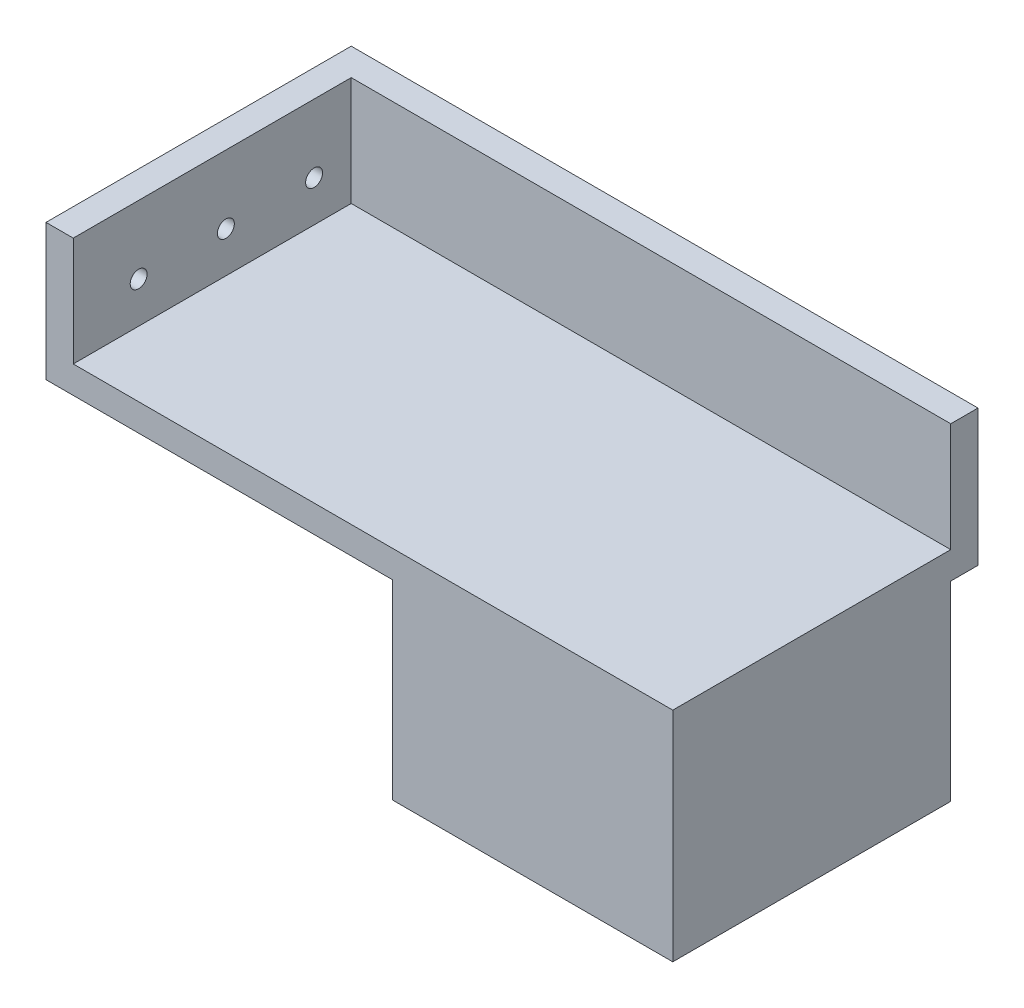
ISO-10303-21;
HEADER;
FILE_DESCRIPTION(('STEP AP214'),'2;1');
FILE_NAME('part.step','',(''),(''),'','','');
FILE_SCHEMA(('AUTOMOTIVE_DESIGN { 1 0 10303 214 1 1 1 1 }'));
ENDSEC;
DATA;
#1=APPLICATION_CONTEXT('core data for automotive mechanical design processes');
#2=APPLICATION_PROTOCOL_DEFINITION('international standard','automotive_design',2000,#1);
#3=PRODUCT_CONTEXT('',#1,'mechanical');
#4=PRODUCT('Part','Part','',(#3));
#5=PRODUCT_RELATED_PRODUCT_CATEGORY('part','',(#4));
#6=PRODUCT_DEFINITION_FORMATION('','',#4);
#7=PRODUCT_DEFINITION_CONTEXT('part definition',#1,'design');
#8=PRODUCT_DEFINITION('design','',#6,#7);
#9=PRODUCT_DEFINITION_SHAPE('','',#8);
#10=(LENGTH_UNIT() NAMED_UNIT(*) SI_UNIT(.MILLI.,.METRE.));
#11=(NAMED_UNIT(*) PLANE_ANGLE_UNIT() SI_UNIT($,.RADIAN.));
#12=(NAMED_UNIT(*) SI_UNIT($,.STERADIAN.) SOLID_ANGLE_UNIT());
#13=UNCERTAINTY_MEASURE_WITH_UNIT(LENGTH_MEASURE(1.E-05),#10,'distance_accuracy_value','');
#14=(GEOMETRIC_REPRESENTATION_CONTEXT(3) GLOBAL_UNCERTAINTY_ASSIGNED_CONTEXT((#13)) GLOBAL_UNIT_ASSIGNED_CONTEXT((#10,
#11,#12)) REPRESENTATION_CONTEXT('',''));
#15=CARTESIAN_POINT('',(0.,0.,0.));
#16=DIRECTION('',(0.,0.,1.));
#17=DIRECTION('',(1.,0.,0.));
#18=AXIS2_PLACEMENT_3D('',#15,#16,#17);
#19=CARTESIAN_POINT('',(0.,0.,0.));
#20=DIRECTION('',(0.,1.,0.));
#21=DIRECTION('',(0.,0.,1.));
#22=AXIS2_PLACEMENT_3D('',#19,#20,#21);
#23=PLANE('',#22);
#24=DIRECTION('',(1.,0.,0.));
#25=VECTOR('',#24,1.);
#26=CARTESIAN_POINT('',(-42.3145161290322,0.,34.4112903225807));
#27=LINE('',#26,#25);
#28=CARTESIAN_POINT('',(-47.3145161290322,0.,34.4112903225807));
#29=VERTEX_POINT('',#28);
#30=CARTESIAN_POINT('',(16.3015100319985,0.,34.4112903225807));
#31=VERTEX_POINT('',#30);
#32=EDGE_CURVE('E216',#29,#31,#27,.T.);
#33=ORIENTED_EDGE('',*,*,#32,.F.);
#34=DIRECTION('',(0.,0.,-1.));
#35=VECTOR('',#34,1.);
#36=CARTESIAN_POINT('',(-47.3145161290322,0.,-16.5887096774193));
#37=LINE('',#36,#35);
#38=CARTESIAN_POINT('',(-47.3145161290322,0.,-21.5887096774193));
#39=VERTEX_POINT('',#38);
#40=EDGE_CURVE('E170',#29,#39,#37,.T.);
#41=ORIENTED_EDGE('',*,*,#40,.T.);
#42=DIRECTION('',(1.,0.,0.));
#43=VECTOR('',#42,1.);
#44=CARTESIAN_POINT('',(-47.3145161290322,0.,-21.5887096774193));
#45=LINE('',#44,#43);
#46=CARTESIAN_POINT('',(67.6854838709677,0.,-21.5887096774193));
#47=VERTEX_POINT('',#46);
#48=EDGE_CURVE('E173',#39,#47,#45,.T.);
#49=ORIENTED_EDGE('',*,*,#48,.T.);
#50=DIRECTION('',(0.,0.,1.));
#51=VECTOR('',#50,1.);
#52=CARTESIAN_POINT('',(67.6854838709677,0.,-16.5887096774193));
#53=LINE('',#52,#51);
#54=CARTESIAN_POINT('',(67.6854838709677,0.,-16.5887096774193));
#55=VERTEX_POINT('',#54);
#56=EDGE_CURVE('E156',#47,#55,#53,.T.);
#57=ORIENTED_EDGE('',*,*,#56,.T.);
#58=DIRECTION('',(-1.,0.,0.));
#59=VECTOR('',#58,1.);
#60=CARTESIAN_POINT('',(-42.3145161290322,0.,-16.5887096774193));
#61=LINE('',#60,#59);
#62=CARTESIAN_POINT('',(62.6854838709677,0.,-16.5887096774193));
#63=VERTEX_POINT('',#62);
#64=EDGE_CURVE('E154',#55,#63,#61,.T.);
#65=ORIENTED_EDGE('',*,*,#64,.T.);
#66=DIRECTION('',(0.,0.,-1.));
#67=VECTOR('',#66,1.);
#68=CARTESIAN_POINT('',(62.6854838709677,0.,0.));
#69=LINE('',#68,#67);
#70=CARTESIAN_POINT('',(62.6854838709677,0.,29.4112903225807));
#71=VERTEX_POINT('',#70);
#72=EDGE_CURVE('E61',#71,#63,#69,.T.);
#73=ORIENTED_EDGE('',*,*,#72,.F.);
#74=DIRECTION('',(-1.,0.,0.));
#75=VECTOR('',#74,1.);
#76=CARTESIAN_POINT('',(0.,0.,29.4112903225807));
#77=LINE('',#76,#75);
#78=CARTESIAN_POINT('',(16.3015100319985,0.,29.4112903225807));
#79=VERTEX_POINT('',#78);
#80=EDGE_CURVE('E56',#71,#79,#77,.T.);
#81=ORIENTED_EDGE('',*,*,#80,.T.);
#82=DIRECTION('',(0.,0.,-1.));
#83=VECTOR('',#82,1.);
#84=CARTESIAN_POINT('',(16.3015100319985,0.,0.));
#85=LINE('',#84,#83);
#86=EDGE_CURVE('E190',#31,#79,#85,.T.);
#87=ORIENTED_EDGE('',*,*,#86,.F.);
#88=EDGE_LOOP('',(#33,#41,#49,#57,#65,#73,#81,#87));
#89=FACE_BOUND('',#88,.T.);
#90=ADVANCED_FACE('F41',(#89),#23,.F.);
#91=CARTESIAN_POINT('',(-42.3145161290322,5.,34.4112903225807));
#92=DIRECTION('',(0.,0.,-1.));
#93=DIRECTION('',(-1.,0.,0.));
#94=AXIS2_PLACEMENT_3D('',#91,#92,#93);
#95=PLANE('',#94);
#96=ORIENTED_EDGE('',*,*,#32,.T.);
#97=DIRECTION('',(0.,1.,0.));
#98=VECTOR('',#97,1.);
#99=CARTESIAN_POINT('',(16.3015100319985,-35.,34.4112903225807));
#100=LINE('',#99,#98);
#101=CARTESIAN_POINT('',(16.3015100319985,-35.,34.4112903225807));
#102=VERTEX_POINT('',#101);
#103=EDGE_CURVE('E208',#102,#31,#100,.T.);
#104=ORIENTED_EDGE('',*,*,#103,.F.);
#105=DIRECTION('',(-1.,0.,0.));
#106=VECTOR('',#105,1.);
#107=CARTESIAN_POINT('',(0.,-35.,34.4112903225807));
#108=LINE('',#107,#106);
#109=CARTESIAN_POINT('',(67.6854838709677,-35.,34.4112903225807));
#110=VERTEX_POINT('',#109);
#111=EDGE_CURVE('E198',#110,#102,#108,.T.);
#112=ORIENTED_EDGE('',*,*,#111,.F.);
#113=DIRECTION('',(0.,-1.,0.));
#114=VECTOR('',#113,1.);
#115=CARTESIAN_POINT('',(67.6854838709677,5.,34.4112903225807));
#116=LINE('',#115,#114);
#117=CARTESIAN_POINT('',(67.6854838709677,5.,34.4112903225807));
#118=VERTEX_POINT('',#117);
#119=EDGE_CURVE('E11',#118,#110,#116,.T.);
#120=ORIENTED_EDGE('',*,*,#119,.F.);
#121=DIRECTION('',(1.,0.,0.));
#122=VECTOR('',#121,1.);
#123=CARTESIAN_POINT('',(-42.3145161290322,5.,34.4112903225807));
#124=LINE('',#123,#122);
#125=CARTESIAN_POINT('',(-42.3145161290322,5.,34.4112903225807));
#126=VERTEX_POINT('',#125);
#127=EDGE_CURVE('E134',#126,#118,#124,.T.);
#128=ORIENTED_EDGE('',*,*,#127,.F.);
#129=DIRECTION('',(0.,-1.,0.));
#130=VECTOR('',#129,1.);
#131=CARTESIAN_POINT('',(-42.3145161290322,25.,34.4112903225807));
#132=LINE('',#131,#130);
#133=CARTESIAN_POINT('',(-42.3145161290322,25.,34.4112903225807));
#134=VERTEX_POINT('',#133);
#135=EDGE_CURVE('E128',#134,#126,#132,.T.);
#136=ORIENTED_EDGE('',*,*,#135,.F.);
#137=DIRECTION('',(-1.,0.,0.));
#138=VECTOR('',#137,1.);
#139=CARTESIAN_POINT('',(-42.3145161290322,25.,34.4112903225807));
#140=LINE('',#139,#138);
#141=CARTESIAN_POINT('',(-47.3145161290322,25.,34.4112903225807));
#142=VERTEX_POINT('',#141);
#143=EDGE_CURVE('E132',#134,#142,#140,.T.);
#144=ORIENTED_EDGE('',*,*,#143,.T.);
#145=DIRECTION('',(0.,-1.,0.));
#146=VECTOR('',#145,1.);
#147=CARTESIAN_POINT('',(-47.3145161290322,25.,34.4112903225807));
#148=LINE('',#147,#146);
#149=EDGE_CURVE('E139',#142,#29,#148,.T.);
#150=ORIENTED_EDGE('',*,*,#149,.T.);
#151=EDGE_LOOP('',(#96,#104,#112,#120,#128,#136,#144,#150));
#152=FACE_BOUND('',#151,.T.);
#153=ADVANCED_FACE('F43',(#152),#95,.F.);
#154=CARTESIAN_POINT('',(67.6854838709677,5.,-16.5887096774193));
#155=DIRECTION('',(-1.,0.,0.));
#156=DIRECTION('',(0.,0.,1.));
#157=AXIS2_PLACEMENT_3D('',#154,#155,#156);
#158=PLANE('',#157);
#159=ORIENTED_EDGE('',*,*,#119,.T.);
#160=DIRECTION('',(0.,0.,1.));
#161=VECTOR('',#160,1.);
#162=CARTESIAN_POINT('',(67.6854838709677,-35.,0.));
#163=LINE('',#162,#161);
#164=CARTESIAN_POINT('',(67.6854838709677,-35.,-16.5887096774193));
#165=VERTEX_POINT('',#164);
#166=EDGE_CURVE('E195',#165,#110,#163,.T.);
#167=ORIENTED_EDGE('',*,*,#166,.F.);
#168=DIRECTION('',(0.,-1.,0.));
#169=VECTOR('',#168,1.);
#170=CARTESIAN_POINT('',(67.6854838709677,5.,-16.5887096774193));
#171=LINE('',#170,#169);
#172=EDGE_CURVE('E49',#55,#165,#171,.T.);
#173=ORIENTED_EDGE('',*,*,#172,.F.);
#174=ORIENTED_EDGE('',*,*,#56,.F.);
#175=DIRECTION('',(0.,-1.,0.));
#176=VECTOR('',#175,1.);
#177=CARTESIAN_POINT('',(67.6854838709677,25.,-21.5887096774193));
#178=LINE('',#177,#176);
#179=CARTESIAN_POINT('',(67.6854838709677,25.,-21.5887096774193));
#180=VERTEX_POINT('',#179);
#181=EDGE_CURVE('E181',#180,#47,#178,.T.);
#182=ORIENTED_EDGE('',*,*,#181,.F.);
#183=DIRECTION('',(0.,0.,1.));
#184=VECTOR('',#183,1.);
#185=CARTESIAN_POINT('',(67.6854838709677,25.,-16.5887096774193));
#186=LINE('',#185,#184);
#187=CARTESIAN_POINT('',(67.6854838709677,25.,-16.5887096774193));
#188=VERTEX_POINT('',#187);
#189=EDGE_CURVE('E166',#180,#188,#186,.T.);
#190=ORIENTED_EDGE('',*,*,#189,.T.);
#191=DIRECTION('',(0.,-1.,0.));
#192=VECTOR('',#191,1.);
#193=CARTESIAN_POINT('',(67.6854838709677,25.,-16.5887096774193));
#194=LINE('',#193,#192);
#195=CARTESIAN_POINT('',(67.6854838709677,5.,-16.5887096774193));
#196=VERTEX_POINT('',#195);
#197=EDGE_CURVE('E178',#188,#196,#194,.T.);
#198=ORIENTED_EDGE('',*,*,#197,.T.);
#199=DIRECTION('',(0.,0.,-1.));
#200=VECTOR('',#199,1.);
#201=CARTESIAN_POINT('',(67.6854838709677,5.,-16.5887096774193));
#202=LINE('',#201,#200);
#203=EDGE_CURVE('E220',#118,#196,#202,.T.);
#204=ORIENTED_EDGE('',*,*,#203,.F.);
#205=EDGE_LOOP('',(#159,#167,#173,#174,#182,#190,#198,#204));
#206=FACE_BOUND('',#205,.T.);
#207=ADVANCED_FACE('F240',(#206),#158,.F.);
#208=CARTESIAN_POINT('',(-42.3145161290323,5.,-16.5887096774193));
#209=DIRECTION('',(0.,0.,1.));
#210=DIRECTION('',(1.,0.,0.));
#211=AXIS2_PLACEMENT_3D('',#208,#209,#210);
#212=PLANE('',#211);
#213=DIRECTION('',(0.,1.,0.));
#214=VECTOR('',#213,1.);
#215=CARTESIAN_POINT('',(62.6854838709677,-35.,-16.5887096774193));
#216=LINE('',#215,#214);
#217=CARTESIAN_POINT('',(62.6854838709677,-35.,-16.5887096774193));
#218=VERTEX_POINT('',#217);
#219=EDGE_CURVE('E211',#218,#63,#216,.T.);
#220=ORIENTED_EDGE('',*,*,#219,.T.);
#221=ORIENTED_EDGE('',*,*,#64,.F.);
#222=ORIENTED_EDGE('',*,*,#172,.T.);
#223=DIRECTION('',(1.,0.,0.));
#224=VECTOR('',#223,1.);
#225=CARTESIAN_POINT('',(0.,-35.,-16.5887096774193));
#226=LINE('',#225,#224);
#227=EDGE_CURVE('E192',#218,#165,#226,.T.);
#228=ORIENTED_EDGE('',*,*,#227,.F.);
#229=EDGE_LOOP('',(#220,#221,#222,#228));
#230=FACE_BOUND('',#229,.T.);
#231=ADVANCED_FACE('F230',(#230),#212,.F.);
#232=CARTESIAN_POINT('',(0.,5.,0.));
#233=DIRECTION('',(0.,1.,0.));
#234=DIRECTION('',(0.,0.,1.));
#235=AXIS2_PLACEMENT_3D('',#232,#233,#234);
#236=PLANE('',#235);
#237=DIRECTION('',(0.,0.,1.));
#238=VECTOR('',#237,1.);
#239=CARTESIAN_POINT('',(-42.3145161290323,5.,-16.5887096774193));
#240=LINE('',#239,#238);
#241=CARTESIAN_POINT('',(-42.3145161290323,5.,-16.5887096774193));
#242=VERTEX_POINT('',#241);
#243=EDGE_CURVE('E217',#242,#126,#240,.T.);
#244=ORIENTED_EDGE('',*,*,#243,.T.);
#245=ORIENTED_EDGE('',*,*,#127,.T.);
#246=ORIENTED_EDGE('',*,*,#203,.T.);
#247=DIRECTION('',(-1.,0.,0.));
#248=VECTOR('',#247,1.);
#249=CARTESIAN_POINT('',(-42.3145161290323,5.,-16.5887096774193));
#250=LINE('',#249,#248);
#251=EDGE_CURVE('E223',#196,#242,#250,.T.);
#252=ORIENTED_EDGE('',*,*,#251,.T.);
#253=EDGE_LOOP('',(#244,#245,#246,#252));
#254=FACE_BOUND('',#253,.T.);
#255=ADVANCED_FACE('F258',(#254),#236,.T.);
#256=CARTESIAN_POINT('',(0.,-35.,29.4112903225807));
#257=DIRECTION('',(0.,0.,-1.));
#258=DIRECTION('',(-1.,0.,0.));
#259=AXIS2_PLACEMENT_3D('',#256,#257,#258);
#260=PLANE('',#259);
#261=ORIENTED_EDGE('',*,*,#80,.F.);
#262=DIRECTION('',(0.,1.,0.));
#263=VECTOR('',#262,1.);
#264=CARTESIAN_POINT('',(62.6854838709677,-35.,29.4112903225807));
#265=LINE('',#264,#263);
#266=CARTESIAN_POINT('',(62.6854838709677,-35.,29.4112903225807));
#267=VERTEX_POINT('',#266);
#268=EDGE_CURVE('E214',#267,#71,#265,.T.);
#269=ORIENTED_EDGE('',*,*,#268,.F.);
#270=DIRECTION('',(-1.,0.,0.));
#271=VECTOR('',#270,1.);
#272=CARTESIAN_POINT('',(0.,-35.,29.4112903225807));
#273=LINE('',#272,#271);
#274=CARTESIAN_POINT('',(16.3015100319985,-35.,29.4112903225807));
#275=VERTEX_POINT('',#274);
#276=EDGE_CURVE('E186',#267,#275,#273,.T.);
#277=ORIENTED_EDGE('',*,*,#276,.T.);
#278=DIRECTION('',(0.,1.,0.));
#279=VECTOR('',#278,1.);
#280=CARTESIAN_POINT('',(16.3015100319985,-35.,29.4112903225807));
#281=LINE('',#280,#279);
#282=EDGE_CURVE('E202',#275,#79,#281,.T.);
#283=ORIENTED_EDGE('',*,*,#282,.T.);
#284=EDGE_LOOP('',(#261,#269,#277,#283));
#285=FACE_BOUND('',#284,.T.);
#286=ADVANCED_FACE('F248',(#285),#260,.T.);
#287=CARTESIAN_POINT('',(62.6854838709677,-35.,0.));
#288=DIRECTION('',(1.,0.,0.));
#289=DIRECTION('',(0.,0.,-1.));
#290=AXIS2_PLACEMENT_3D('',#287,#288,#289);
#291=PLANE('',#290);
#292=ORIENTED_EDGE('',*,*,#72,.T.);
#293=ORIENTED_EDGE('',*,*,#219,.F.);
#294=DIRECTION('',(0.,0.,-1.));
#295=VECTOR('',#294,1.);
#296=CARTESIAN_POINT('',(62.6854838709677,-35.,0.));
#297=LINE('',#296,#295);
#298=EDGE_CURVE('E189',#267,#218,#297,.T.);
#299=ORIENTED_EDGE('',*,*,#298,.F.);
#300=ORIENTED_EDGE('',*,*,#268,.T.);
#301=EDGE_LOOP('',(#292,#293,#299,#300));
#302=FACE_BOUND('',#301,.T.);
#303=ADVANCED_FACE('F250',(#302),#291,.F.);
#304=CARTESIAN_POINT('',(16.3015100319985,-35.,0.));
#305=DIRECTION('',(1.,0.,0.));
#306=DIRECTION('',(0.,0.,-1.));
#307=AXIS2_PLACEMENT_3D('',#304,#305,#306);
#308=PLANE('',#307);
#309=ORIENTED_EDGE('',*,*,#86,.T.);
#310=ORIENTED_EDGE('',*,*,#282,.F.);
#311=DIRECTION('',(0.,0.,-1.));
#312=VECTOR('',#311,1.);
#313=CARTESIAN_POINT('',(16.3015100319985,-35.,0.));
#314=LINE('',#313,#312);
#315=EDGE_CURVE('E200',#102,#275,#314,.T.);
#316=ORIENTED_EDGE('',*,*,#315,.F.);
#317=ORIENTED_EDGE('',*,*,#103,.T.);
#318=EDGE_LOOP('',(#309,#310,#316,#317));
#319=FACE_BOUND('',#318,.T.);
#320=ADVANCED_FACE('F246',(#319),#308,.F.);
#321=CARTESIAN_POINT('',(0.,-35.,0.));
#322=DIRECTION('',(0.,-1.,0.));
#323=DIRECTION('',(0.,0.,-1.));
#324=AXIS2_PLACEMENT_3D('',#321,#322,#323);
#325=PLANE('',#324);
#326=ORIENTED_EDGE('',*,*,#276,.F.);
#327=ORIENTED_EDGE('',*,*,#298,.T.);
#328=ORIENTED_EDGE('',*,*,#227,.T.);
#329=ORIENTED_EDGE('',*,*,#166,.T.);
#330=ORIENTED_EDGE('',*,*,#111,.T.);
#331=ORIENTED_EDGE('',*,*,#315,.T.);
#332=EDGE_LOOP('',(#326,#327,#328,#329,#330,#331));
#333=FACE_BOUND('',#332,.T.);
#334=ADVANCED_FACE('F236',(#333),#325,.T.);
#335=CARTESIAN_POINT('',(-42.3145161290322,25.,34.4112903225807));
#336=DIRECTION('',(1.,0.,0.));
#337=DIRECTION('',(0.,0.,-1.));
#338=AXIS2_PLACEMENT_3D('',#335,#336,#337);
#339=PLANE('',#338);
#340=CARTESIAN_POINT('',(-42.3145161290323,12.5,-9.77592356742909));
#341=DIRECTION('',(1.,0.,0.));
#342=DIRECTION('',(0.,0.,-1.));
#343=AXIS2_PLACEMENT_3D('',#340,#341,#342);
#344=CIRCLE('',#343,1.55);
#345=CARTESIAN_POINT('',(-42.3145161290323,12.5,-11.3259235674291));
#346=VERTEX_POINT('',#345);
#347=EDGE_CURVE('E159',#346,#346,#344,.T.);
#348=ORIENTED_EDGE('',*,*,#347,.F.);
#349=EDGE_LOOP('',(#348));
#350=FACE_BOUND('',#349,.T.);
#351=CARTESIAN_POINT('',(-42.3145161290323,12.5,6.41129032258069));
#352=DIRECTION('',(1.,0.,0.));
#353=DIRECTION('',(0.,0.,-1.));
#354=AXIS2_PLACEMENT_3D('',#351,#352,#353);
#355=CIRCLE('',#354,1.55);
#356=CARTESIAN_POINT('',(-42.3145161290323,12.5,4.86129032258069));
#357=VERTEX_POINT('',#356);
#358=EDGE_CURVE('E448',#357,#357,#355,.T.);
#359=ORIENTED_EDGE('',*,*,#358,.F.);
#360=EDGE_LOOP('',(#359));
#361=FACE_BOUND('',#360,.T.);
#362=CARTESIAN_POINT('',(-42.3145161290323,12.5,22.4112903225807));
#363=DIRECTION('',(1.,0.,0.));
#364=DIRECTION('',(0.,0.,-1.));
#365=AXIS2_PLACEMENT_3D('',#362,#363,#364);
#366=CIRCLE('',#365,1.55);
#367=CARTESIAN_POINT('',(-42.3145161290323,12.5,20.8612903225807));
#368=VERTEX_POINT('',#367);
#369=EDGE_CURVE('E444',#368,#368,#366,.T.);
#370=ORIENTED_EDGE('',*,*,#369,.F.);
#371=EDGE_LOOP('',(#370));
#372=FACE_BOUND('',#371,.T.);
#373=ORIENTED_EDGE('',*,*,#135,.T.);
#374=ORIENTED_EDGE('',*,*,#243,.F.);
#375=DIRECTION('',(0.,-1.,0.));
#376=VECTOR('',#375,1.);
#377=CARTESIAN_POINT('',(-42.3145161290322,25.,-16.5887096774193));
#378=LINE('',#377,#376);
#379=CARTESIAN_POINT('',(-42.3145161290322,25.,-16.5887096774193));
#380=VERTEX_POINT('',#379);
#381=EDGE_CURVE('E153',#380,#242,#378,.T.);
#382=ORIENTED_EDGE('',*,*,#381,.F.);
#383=DIRECTION('',(0.,0.,1.));
#384=VECTOR('',#383,1.);
#385=CARTESIAN_POINT('',(-42.3145161290322,25.,34.4112903225807));
#386=LINE('',#385,#384);
#387=EDGE_CURVE('E147',#380,#134,#386,.T.);
#388=ORIENTED_EDGE('',*,*,#387,.T.);
#389=EDGE_LOOP('',(#373,#374,#382,#388));
#390=FACE_BOUND('',#389,.T.);
#391=ADVANCED_FACE('F152',(#350,#361,#372,#390),#339,.T.);
#392=CARTESIAN_POINT('',(-42.3145161290322,25.,-16.5887096774193));
#393=DIRECTION('',(0.,0.,1.));
#394=DIRECTION('',(1.,0.,0.));
#395=AXIS2_PLACEMENT_3D('',#392,#393,#394);
#396=PLANE('',#395);
#397=ORIENTED_EDGE('',*,*,#381,.T.);
#398=ORIENTED_EDGE('',*,*,#251,.F.);
#399=ORIENTED_EDGE('',*,*,#197,.F.);
#400=DIRECTION('',(-1.,0.,0.));
#401=VECTOR('',#400,1.);
#402=CARTESIAN_POINT('',(-42.3145161290322,25.,-16.5887096774193));
#403=LINE('',#402,#401);
#404=EDGE_CURVE('E140',#188,#380,#403,.T.);
#405=ORIENTED_EDGE('',*,*,#404,.T.);
#406=EDGE_LOOP('',(#397,#398,#399,#405));
#407=FACE_BOUND('',#406,.T.);
#408=ADVANCED_FACE('F311',(#407),#396,.T.);
#409=CARTESIAN_POINT('',(-47.3145161290322,25.,-21.5887096774193));
#410=DIRECTION('',(0.,0.,-1.));
#411=DIRECTION('',(-1.,0.,0.));
#412=AXIS2_PLACEMENT_3D('',#409,#410,#411);
#413=PLANE('',#412);
#414=ORIENTED_EDGE('',*,*,#48,.F.);
#415=DIRECTION('',(0.,-1.,0.));
#416=VECTOR('',#415,1.);
#417=CARTESIAN_POINT('',(-47.3145161290322,25.,-21.5887096774193));
#418=LINE('',#417,#416);
#419=CARTESIAN_POINT('',(-47.3145161290322,25.,-21.5887096774193));
#420=VERTEX_POINT('',#419);
#421=EDGE_CURVE('E183',#420,#39,#418,.T.);
#422=ORIENTED_EDGE('',*,*,#421,.F.);
#423=DIRECTION('',(1.,0.,0.));
#424=VECTOR('',#423,1.);
#425=CARTESIAN_POINT('',(-47.3145161290322,25.,-21.5887096774193));
#426=LINE('',#425,#424);
#427=EDGE_CURVE('E163',#420,#180,#426,.T.);
#428=ORIENTED_EDGE('',*,*,#427,.T.);
#429=ORIENTED_EDGE('',*,*,#181,.T.);
#430=EDGE_LOOP('',(#414,#422,#428,#429));
#431=FACE_BOUND('',#430,.T.);
#432=ADVANCED_FACE('F321',(#431),#413,.T.);
#433=CARTESIAN_POINT('',(-47.3145161290322,25.,-16.5887096774193));
#434=DIRECTION('',(-1.,0.,0.));
#435=DIRECTION('',(0.,0.,1.));
#436=AXIS2_PLACEMENT_3D('',#433,#434,#435);
#437=PLANE('',#436);
#438=CARTESIAN_POINT('',(-47.3145161290322,12.5,-9.77592356742909));
#439=DIRECTION('',(-1.,0.,0.));
#440=DIRECTION('',(0.,0.,1.));
#441=AXIS2_PLACEMENT_3D('',#438,#439,#440);
#442=CIRCLE('',#441,1.55);
#443=CARTESIAN_POINT('',(-47.3145161290322,12.5,-8.22592356742909));
#444=VERTEX_POINT('',#443);
#445=EDGE_CURVE('E443',#444,#444,#442,.T.);
#446=ORIENTED_EDGE('',*,*,#445,.F.);
#447=EDGE_LOOP('',(#446));
#448=FACE_BOUND('',#447,.T.);
#449=CARTESIAN_POINT('',(-47.3145161290322,12.5,6.41129032258069));
#450=DIRECTION('',(-1.,0.,0.));
#451=DIRECTION('',(0.,0.,1.));
#452=AXIS2_PLACEMENT_3D('',#449,#450,#451);
#453=CIRCLE('',#452,1.55);
#454=CARTESIAN_POINT('',(-47.3145161290322,12.5,7.96129032258069));
#455=VERTEX_POINT('',#454);
#456=EDGE_CURVE('E445',#455,#455,#453,.T.);
#457=ORIENTED_EDGE('',*,*,#456,.F.);
#458=EDGE_LOOP('',(#457));
#459=FACE_BOUND('',#458,.T.);
#460=CARTESIAN_POINT('',(-47.3145161290322,12.5,22.4112903225807));
#461=DIRECTION('',(-1.,0.,0.));
#462=DIRECTION('',(0.,0.,1.));
#463=AXIS2_PLACEMENT_3D('',#460,#461,#462);
#464=CIRCLE('',#463,1.55);
#465=CARTESIAN_POINT('',(-47.3145161290322,12.5,23.9612903225807));
#466=VERTEX_POINT('',#465);
#467=EDGE_CURVE('E451',#466,#466,#464,.T.);
#468=ORIENTED_EDGE('',*,*,#467,.F.);
#469=EDGE_LOOP('',(#468));
#470=FACE_BOUND('',#469,.T.);
#471=ORIENTED_EDGE('',*,*,#40,.F.);
#472=ORIENTED_EDGE('',*,*,#149,.F.);
#473=DIRECTION('',(0.,0.,-1.));
#474=VECTOR('',#473,1.);
#475=CARTESIAN_POINT('',(-47.3145161290322,25.,34.4112903225807));
#476=LINE('',#475,#474);
#477=EDGE_CURVE('E150',#142,#420,#476,.T.);
#478=ORIENTED_EDGE('',*,*,#477,.T.);
#479=ORIENTED_EDGE('',*,*,#421,.T.);
#480=EDGE_LOOP('',(#471,#472,#478,#479));
#481=FACE_BOUND('',#480,.T.);
#482=ADVANCED_FACE('F330',(#448,#459,#470,#481),#437,.T.);
#483=CARTESIAN_POINT('',(0.,25.,0.));
#484=DIRECTION('',(0.,-1.,0.));
#485=DIRECTION('',(0.,0.,-1.));
#486=AXIS2_PLACEMENT_3D('',#483,#484,#485);
#487=PLANE('',#486);
#488=ORIENTED_EDGE('',*,*,#387,.F.);
#489=ORIENTED_EDGE('',*,*,#404,.F.);
#490=ORIENTED_EDGE('',*,*,#189,.F.);
#491=ORIENTED_EDGE('',*,*,#427,.F.);
#492=ORIENTED_EDGE('',*,*,#477,.F.);
#493=ORIENTED_EDGE('',*,*,#143,.F.);
#494=EDGE_LOOP('',(#488,#489,#490,#491,#492,#493));
#495=FACE_BOUND('',#494,.T.);
#496=ADVANCED_FACE('F145',(#495),#487,.F.);
#497=CARTESIAN_POINT('',(67.6854838709678,12.5,22.4112903225807));
#498=DIRECTION('',(-1.,0.,0.));
#499=DIRECTION('',(0.,0.,1.));
#500=AXIS2_PLACEMENT_3D('',#497,#498,#499);
#501=CYLINDRICAL_SURFACE('',#500,1.55);
#502=ORIENTED_EDGE('',*,*,#369,.T.);
#503=EDGE_LOOP('',(#502));
#504=FACE_BOUND('',#503,.T.);
#505=ORIENTED_EDGE('',*,*,#467,.T.);
#506=EDGE_LOOP('',(#505));
#507=FACE_BOUND('',#506,.T.);
#508=ADVANCED_FACE('F347',(#504,#507),#501,.F.);
#509=CARTESIAN_POINT('',(67.6854838709678,12.5,6.41129032258069));
#510=DIRECTION('',(-1.,0.,0.));
#511=DIRECTION('',(0.,0.,1.));
#512=AXIS2_PLACEMENT_3D('',#509,#510,#511);
#513=CYLINDRICAL_SURFACE('',#512,1.55);
#514=ORIENTED_EDGE('',*,*,#358,.T.);
#515=EDGE_LOOP('',(#514));
#516=FACE_BOUND('',#515,.T.);
#517=ORIENTED_EDGE('',*,*,#456,.T.);
#518=EDGE_LOOP('',(#517));
#519=FACE_BOUND('',#518,.T.);
#520=ADVANCED_FACE('F355',(#516,#519),#513,.F.);
#521=CARTESIAN_POINT('',(67.6854838709678,12.5,-9.77592356742909));
#522=DIRECTION('',(-1.,0.,0.));
#523=DIRECTION('',(0.,0.,1.));
#524=AXIS2_PLACEMENT_3D('',#521,#522,#523);
#525=CYLINDRICAL_SURFACE('',#524,1.55);
#526=ORIENTED_EDGE('',*,*,#347,.T.);
#527=EDGE_LOOP('',(#526));
#528=FACE_BOUND('',#527,.T.);
#529=ORIENTED_EDGE('',*,*,#445,.T.);
#530=EDGE_LOOP('',(#529));
#531=FACE_BOUND('',#530,.T.);
#532=ADVANCED_FACE('F364',(#528,#531),#525,.F.);
#533=CLOSED_SHELL('',(#90,#153,#207,#231,#255,#286,#303,#320,#334,#391,#408,#432,#482,#496,#508,
#520,#532));
#534=MANIFOLD_SOLID_BREP('B2',#533);
#535=ADVANCED_BREP_SHAPE_REPRESENTATION('',(#18,#534),#14);
#536=SHAPE_DEFINITION_REPRESENTATION(#9,#535);
ENDSEC;
END-ISO-10303-21;
